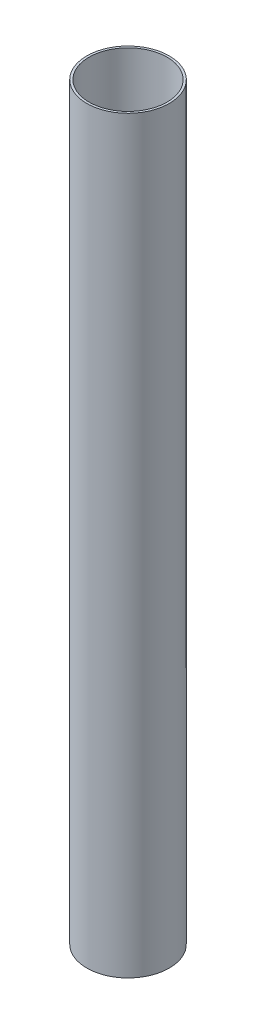
ISO-10303-21;
HEADER;
FILE_DESCRIPTION(('STEP AP214'),'2;1');
FILE_NAME('part.step','',(''),(''),'','','');
FILE_SCHEMA(('AUTOMOTIVE_DESIGN { 1 0 10303 214 1 1 1 1 }'));
ENDSEC;
DATA;
#1=APPLICATION_CONTEXT('core data for automotive mechanical design processes');
#2=APPLICATION_PROTOCOL_DEFINITION('international standard','automotive_design',2000,#1);
#3=PRODUCT_CONTEXT('',#1,'mechanical');
#4=PRODUCT('Part','Part','',(#3));
#5=PRODUCT_RELATED_PRODUCT_CATEGORY('part','',(#4));
#6=PRODUCT_DEFINITION_FORMATION('','',#4);
#7=PRODUCT_DEFINITION_CONTEXT('part definition',#1,'design');
#8=PRODUCT_DEFINITION('design','',#6,#7);
#9=PRODUCT_DEFINITION_SHAPE('','',#8);
#10=(LENGTH_UNIT() NAMED_UNIT(*) SI_UNIT(.MILLI.,.METRE.));
#11=(NAMED_UNIT(*) PLANE_ANGLE_UNIT() SI_UNIT($,.RADIAN.));
#12=(NAMED_UNIT(*) SI_UNIT($,.STERADIAN.) SOLID_ANGLE_UNIT());
#13=UNCERTAINTY_MEASURE_WITH_UNIT(LENGTH_MEASURE(1.E-05),#10,'distance_accuracy_value','');
#14=(GEOMETRIC_REPRESENTATION_CONTEXT(3) GLOBAL_UNCERTAINTY_ASSIGNED_CONTEXT((#13)) GLOBAL_UNIT_ASSIGNED_CONTEXT((#10,
#11,#12)) REPRESENTATION_CONTEXT('',''));
#15=CARTESIAN_POINT('',(0.,0.,0.));
#16=DIRECTION('',(0.,0.,1.));
#17=DIRECTION('',(1.,0.,0.));
#18=AXIS2_PLACEMENT_3D('',#15,#16,#17);
#19=CARTESIAN_POINT('',(0.,609.6,0.));
#20=DIRECTION('',(0.,1.,0.));
#21=DIRECTION('',(0.,0.,1.));
#22=AXIS2_PLACEMENT_3D('',#19,#20,#21);
#23=PLANE('',#22);
#24=CARTESIAN_POINT('',(0.,609.6,0.));
#25=DIRECTION('',(0.,1.,0.));
#26=DIRECTION('',(0.,0.,1.));
#27=AXIS2_PLACEMENT_3D('',#24,#25,#26);
#28=CIRCLE('',#27,33.57);
#29=CARTESIAN_POINT('',(0.,609.6,-33.57));
#30=VERTEX_POINT('',#29);
#31=EDGE_CURVE('E10',#30,#30,#28,.T.);
#32=ORIENTED_EDGE('',*,*,#31,.T.);
#33=EDGE_LOOP('',(#32));
#34=FACE_BOUND('',#33,.T.);
#35=CARTESIAN_POINT('',(0.,609.6,0.));
#36=DIRECTION('',(0.,1.,0.));
#37=DIRECTION('',(0.,0.,1.));
#38=AXIS2_PLACEMENT_3D('',#35,#36,#37);
#39=CIRCLE('',#38,31.75);
#40=CARTESIAN_POINT('',(0.,609.6,-31.75));
#41=VERTEX_POINT('',#40);
#42=EDGE_CURVE('E47',#41,#41,#39,.T.);
#43=ORIENTED_EDGE('',*,*,#42,.F.);
#44=EDGE_LOOP('',(#43));
#45=FACE_BOUND('',#44,.T.);
#46=ADVANCED_FACE('F36',(#34,#45),#23,.T.);
#47=CARTESIAN_POINT('',(0.,0.,0.));
#48=DIRECTION('',(0.,1.,0.));
#49=DIRECTION('',(0.,0.,1.));
#50=AXIS2_PLACEMENT_3D('',#47,#48,#49);
#51=PLANE('',#50);
#52=CARTESIAN_POINT('',(0.,0.,0.));
#53=DIRECTION('',(0.,1.,0.));
#54=DIRECTION('',(0.,0.,1.));
#55=AXIS2_PLACEMENT_3D('',#52,#53,#54);
#56=CIRCLE('',#55,33.57);
#57=CARTESIAN_POINT('',(0.,0.,-33.57));
#58=VERTEX_POINT('',#57);
#59=EDGE_CURVE('E40',#58,#58,#56,.T.);
#60=ORIENTED_EDGE('',*,*,#59,.F.);
#61=EDGE_LOOP('',(#60));
#62=FACE_BOUND('',#61,.T.);
#63=CARTESIAN_POINT('',(0.,0.,0.));
#64=DIRECTION('',(0.,1.,0.));
#65=DIRECTION('',(0.,0.,1.));
#66=AXIS2_PLACEMENT_3D('',#63,#64,#65);
#67=CIRCLE('',#66,31.75);
#68=CARTESIAN_POINT('',(0.,0.,-31.75));
#69=VERTEX_POINT('',#68);
#70=EDGE_CURVE('E49',#69,#69,#67,.T.);
#71=ORIENTED_EDGE('',*,*,#70,.T.);
#72=EDGE_LOOP('',(#71));
#73=FACE_BOUND('',#72,.T.);
#74=ADVANCED_FACE('F59',(#62,#73),#51,.F.);
#75=CARTESIAN_POINT('',(0.,609.6,0.));
#76=DIRECTION('',(0.,-1.,0.));
#77=DIRECTION('',(0.,0.,-1.));
#78=AXIS2_PLACEMENT_3D('',#75,#76,#77);
#79=CYLINDRICAL_SURFACE('',#78,33.57);
#80=CARTESIAN_POINT('',(0.,609.6,-33.57));
#81=CARTESIAN_POINT('',(0.,603.25,-33.57));
#82=CARTESIAN_POINT('',(0.,596.9,-33.57));
#83=CARTESIAN_POINT('',(0.,584.2,-33.57));
#84=CARTESIAN_POINT('',(0.,577.85,-33.57));
#85=CARTESIAN_POINT('',(0.,565.15,-33.57));
#86=CARTESIAN_POINT('',(0.,558.8,-33.57));
#87=CARTESIAN_POINT('',(0.,546.1,-33.57));
#88=CARTESIAN_POINT('',(0.,539.75,-33.57));
#89=CARTESIAN_POINT('',(0.,527.05,-33.57));
#90=CARTESIAN_POINT('',(0.,520.7,-33.57));
#91=CARTESIAN_POINT('',(0.,508.,-33.57));
#92=CARTESIAN_POINT('',(0.,501.65,-33.57));
#93=CARTESIAN_POINT('',(0.,488.95,-33.57));
#94=CARTESIAN_POINT('',(0.,482.6,-33.57));
#95=CARTESIAN_POINT('',(0.,469.9,-33.57));
#96=CARTESIAN_POINT('',(0.,463.55,-33.57));
#97=CARTESIAN_POINT('',(0.,450.85,-33.57));
#98=CARTESIAN_POINT('',(0.,444.5,-33.57));
#99=CARTESIAN_POINT('',(0.,431.8,-33.57));
#100=CARTESIAN_POINT('',(0.,425.45,-33.57));
#101=CARTESIAN_POINT('',(0.,412.75,-33.57));
#102=CARTESIAN_POINT('',(0.,406.4,-33.57));
#103=CARTESIAN_POINT('',(0.,393.7,-33.57));
#104=CARTESIAN_POINT('',(0.,387.35,-33.57));
#105=CARTESIAN_POINT('',(0.,374.65,-33.57));
#106=CARTESIAN_POINT('',(0.,368.3,-33.57));
#107=CARTESIAN_POINT('',(0.,355.6,-33.57));
#108=CARTESIAN_POINT('',(0.,349.25,-33.57));
#109=CARTESIAN_POINT('',(0.,336.55,-33.57));
#110=CARTESIAN_POINT('',(0.,330.2,-33.57));
#111=CARTESIAN_POINT('',(0.,317.5,-33.57));
#112=CARTESIAN_POINT('',(0.,311.15,-33.57));
#113=CARTESIAN_POINT('',(0.,298.45,-33.57));
#114=CARTESIAN_POINT('',(0.,292.1,-33.57));
#115=CARTESIAN_POINT('',(0.,279.4,-33.57));
#116=CARTESIAN_POINT('',(0.,273.05,-33.57));
#117=CARTESIAN_POINT('',(0.,260.35,-33.57));
#118=CARTESIAN_POINT('',(0.,254.,-33.57));
#119=CARTESIAN_POINT('',(0.,241.3,-33.57));
#120=CARTESIAN_POINT('',(0.,234.95,-33.57));
#121=CARTESIAN_POINT('',(0.,222.25,-33.57));
#122=CARTESIAN_POINT('',(0.,215.9,-33.57));
#123=CARTESIAN_POINT('',(0.,203.2,-33.57));
#124=CARTESIAN_POINT('',(0.,196.85,-33.57));
#125=CARTESIAN_POINT('',(0.,184.15,-33.57));
#126=CARTESIAN_POINT('',(0.,177.8,-33.57));
#127=CARTESIAN_POINT('',(0.,165.1,-33.57));
#128=CARTESIAN_POINT('',(0.,158.75,-33.57));
#129=CARTESIAN_POINT('',(0.,146.05,-33.57));
#130=CARTESIAN_POINT('',(0.,139.7,-33.57));
#131=CARTESIAN_POINT('',(0.,127.,-33.57));
#132=CARTESIAN_POINT('',(0.,120.65,-33.57));
#133=CARTESIAN_POINT('',(0.,107.95,-33.57));
#134=CARTESIAN_POINT('',(0.,101.6,-33.57));
#135=CARTESIAN_POINT('',(0.,88.9,-33.57));
#136=CARTESIAN_POINT('',(0.,82.5500000000001,-33.57));
#137=CARTESIAN_POINT('',(0.,69.85,-33.57));
#138=CARTESIAN_POINT('',(0.,63.5,-33.57));
#139=CARTESIAN_POINT('',(0.,50.8,-33.57));
#140=CARTESIAN_POINT('',(0.,44.45,-33.57));
#141=CARTESIAN_POINT('',(0.,31.75,-33.57));
#142=CARTESIAN_POINT('',(0.,25.4,-33.57));
#143=CARTESIAN_POINT('',(0.,12.7,-33.57));
#144=CARTESIAN_POINT('',(0.,6.35000000000001,-33.57));
#145=CARTESIAN_POINT('',(0.,0.,-33.57));
#146=B_SPLINE_CURVE_WITH_KNOTS('',3,(#80,#81,#82,#83,#84,#85,#86,#87,#88,#89,#90,#91,#92,#93,
#94,#95,#96,#97,#98,#99,#100,#101,#102,#103,#104,#105,#106,#107,#108,#109,#110,#111,#112,#113,
#114,#115,#116,#117,#118,#119,#120,#121,#122,#123,#124,#125,#126,#127,#128,#129,#130,#131,#132,
#133,#134,#135,#136,#137,#138,#139,#140,#141,#142,#143,#144,#145),.UNSPECIFIED.,.F.,.F.,(4,2,2,
2,2,2,2,2,2,2,2,2,2,2,2,2,2,2,2,2,2,2,2,2,2,2,2,2,2,2,2,2,4),(0.,19.05,38.1,57.15,76.2,
95.2500000000001,114.3,133.35,152.4,171.45,190.5,209.55,228.6,247.65,266.7,285.75,304.8,323.85,
342.9,361.95,381.,400.05,419.1,438.15,457.2,476.25,495.3,514.35,533.4,552.45,571.5,590.55,
609.6),.UNSPECIFIED.);
#147=EDGE_CURVE('BSEAM38',#30,#58,#146,.T.);
#148=ORIENTED_EDGE('',*,*,#31,.F.);
#149=ORIENTED_EDGE('',*,*,#59,.T.);
#150=ORIENTED_EDGE('',*,*,#147,.T.);
#151=ORIENTED_EDGE('',*,*,#147,.F.);
#152=EDGE_LOOP('',(#148,#150,#149,#151));
#153=FACE_BOUND('',#152,.T.);
#154=ADVANCED_FACE('F38',(#153),#79,.T.);
#155=CARTESIAN_POINT('',(0.,609.6,0.));
#156=DIRECTION('',(0.,-1.,0.));
#157=DIRECTION('',(0.,0.,-1.));
#158=AXIS2_PLACEMENT_3D('',#155,#156,#157);
#159=CYLINDRICAL_SURFACE('',#158,31.75);
#160=CARTESIAN_POINT('',(0.,609.6,-31.75));
#161=CARTESIAN_POINT('',(0.,603.25,-31.75));
#162=CARTESIAN_POINT('',(0.,596.9,-31.75));
#163=CARTESIAN_POINT('',(0.,584.2,-31.75));
#164=CARTESIAN_POINT('',(0.,577.85,-31.75));
#165=CARTESIAN_POINT('',(0.,565.15,-31.75));
#166=CARTESIAN_POINT('',(0.,558.8,-31.75));
#167=CARTESIAN_POINT('',(0.,546.1,-31.75));
#168=CARTESIAN_POINT('',(0.,539.75,-31.75));
#169=CARTESIAN_POINT('',(0.,527.05,-31.75));
#170=CARTESIAN_POINT('',(0.,520.7,-31.75));
#171=CARTESIAN_POINT('',(0.,508.,-31.75));
#172=CARTESIAN_POINT('',(0.,501.65,-31.75));
#173=CARTESIAN_POINT('',(0.,488.95,-31.75));
#174=CARTESIAN_POINT('',(0.,482.6,-31.75));
#175=CARTESIAN_POINT('',(0.,469.9,-31.75));
#176=CARTESIAN_POINT('',(0.,463.55,-31.75));
#177=CARTESIAN_POINT('',(0.,450.85,-31.75));
#178=CARTESIAN_POINT('',(0.,444.5,-31.75));
#179=CARTESIAN_POINT('',(0.,431.8,-31.75));
#180=CARTESIAN_POINT('',(0.,425.45,-31.75));
#181=CARTESIAN_POINT('',(0.,412.75,-31.75));
#182=CARTESIAN_POINT('',(0.,406.4,-31.75));
#183=CARTESIAN_POINT('',(0.,393.7,-31.75));
#184=CARTESIAN_POINT('',(0.,387.35,-31.75));
#185=CARTESIAN_POINT('',(0.,374.65,-31.75));
#186=CARTESIAN_POINT('',(0.,368.3,-31.75));
#187=CARTESIAN_POINT('',(0.,355.6,-31.75));
#188=CARTESIAN_POINT('',(0.,349.25,-31.75));
#189=CARTESIAN_POINT('',(0.,336.55,-31.75));
#190=CARTESIAN_POINT('',(0.,330.2,-31.75));
#191=CARTESIAN_POINT('',(0.,317.5,-31.75));
#192=CARTESIAN_POINT('',(0.,311.15,-31.75));
#193=CARTESIAN_POINT('',(0.,298.45,-31.75));
#194=CARTESIAN_POINT('',(0.,292.1,-31.75));
#195=CARTESIAN_POINT('',(0.,279.4,-31.75));
#196=CARTESIAN_POINT('',(0.,273.05,-31.75));
#197=CARTESIAN_POINT('',(0.,260.35,-31.75));
#198=CARTESIAN_POINT('',(0.,254.,-31.75));
#199=CARTESIAN_POINT('',(0.,241.3,-31.75));
#200=CARTESIAN_POINT('',(0.,234.95,-31.75));
#201=CARTESIAN_POINT('',(0.,222.25,-31.75));
#202=CARTESIAN_POINT('',(0.,215.9,-31.75));
#203=CARTESIAN_POINT('',(0.,203.2,-31.75));
#204=CARTESIAN_POINT('',(0.,196.85,-31.75));
#205=CARTESIAN_POINT('',(0.,184.15,-31.75));
#206=CARTESIAN_POINT('',(0.,177.8,-31.75));
#207=CARTESIAN_POINT('',(0.,165.1,-31.75));
#208=CARTESIAN_POINT('',(0.,158.75,-31.75));
#209=CARTESIAN_POINT('',(0.,146.05,-31.75));
#210=CARTESIAN_POINT('',(0.,139.7,-31.75));
#211=CARTESIAN_POINT('',(0.,127.,-31.75));
#212=CARTESIAN_POINT('',(0.,120.65,-31.75));
#213=CARTESIAN_POINT('',(0.,107.95,-31.75));
#214=CARTESIAN_POINT('',(0.,101.6,-31.75));
#215=CARTESIAN_POINT('',(0.,88.9,-31.75));
#216=CARTESIAN_POINT('',(0.,82.5500000000001,-31.75));
#217=CARTESIAN_POINT('',(0.,69.85,-31.75));
#218=CARTESIAN_POINT('',(0.,63.5,-31.75));
#219=CARTESIAN_POINT('',(0.,50.8,-31.75));
#220=CARTESIAN_POINT('',(0.,44.45,-31.75));
#221=CARTESIAN_POINT('',(0.,31.75,-31.75));
#222=CARTESIAN_POINT('',(0.,25.4,-31.75));
#223=CARTESIAN_POINT('',(0.,12.7,-31.75));
#224=CARTESIAN_POINT('',(0.,6.35000000000001,-31.75));
#225=CARTESIAN_POINT('',(0.,0.,-31.75));
#226=B_SPLINE_CURVE_WITH_KNOTS('',3,(#160,#161,#162,#163,#164,#165,#166,#167,#168,#169,#170,
#171,#172,#173,#174,#175,#176,#177,#178,#179,#180,#181,#182,#183,#184,#185,#186,#187,#188,#189,
#190,#191,#192,#193,#194,#195,#196,#197,#198,#199,#200,#201,#202,#203,#204,#205,#206,#207,#208,
#209,#210,#211,#212,#213,#214,#215,#216,#217,#218,#219,#220,#221,#222,#223,#224,#225),
.UNSPECIFIED.,.F.,.F.,(4,2,2,2,2,2,2,2,2,2,2,2,2,2,2,2,2,2,2,2,2,2,2,2,2,2,2,2,2,2,2,2,4),(0.,
19.05,38.1,57.15,76.2,95.2500000000001,114.3,133.35,152.4,171.45,190.5,209.55,228.6,247.65,
266.7,285.75,304.8,323.85,342.9,361.95,381.,400.05,419.1,438.15,457.2,476.25,495.3,514.35,533.4,
552.45,571.5,590.55,609.6),.UNSPECIFIED.);
#227=EDGE_CURVE('BSEAM55',#41,#69,#226,.T.);
#228=ORIENTED_EDGE('',*,*,#42,.T.);
#229=ORIENTED_EDGE('',*,*,#70,.F.);
#230=ORIENTED_EDGE('',*,*,#227,.T.);
#231=ORIENTED_EDGE('',*,*,#227,.F.);
#232=EDGE_LOOP('',(#228,#230,#229,#231));
#233=FACE_BOUND('',#232,.T.);
#234=ADVANCED_FACE('F55',(#233),#159,.F.);
#235=CLOSED_SHELL('',(#46,#74,#154,#234));
#236=MANIFOLD_SOLID_BREP('B2',#235);
#237=ADVANCED_BREP_SHAPE_REPRESENTATION('',(#18,#236),#14);
#238=SHAPE_DEFINITION_REPRESENTATION(#9,#237);
ENDSEC;
END-ISO-10303-21;
